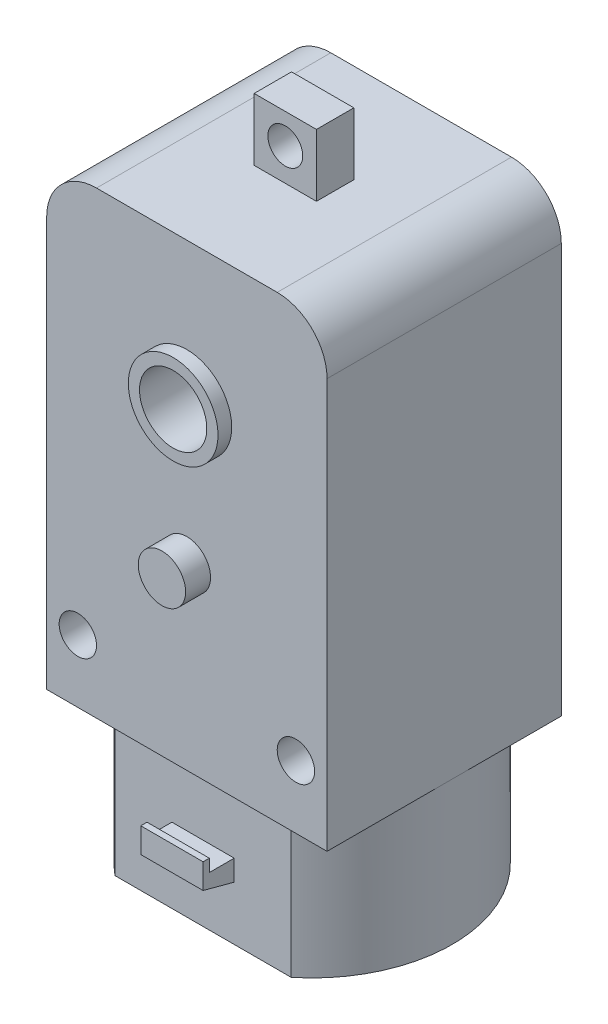
ISO-10303-21;
HEADER;
FILE_DESCRIPTION(('STEP AP214'),'2;1');
FILE_NAME('part.step','',(''),(''),'','','');
FILE_SCHEMA(('AUTOMOTIVE_DESIGN { 1 0 10303 214 1 1 1 1 }'));
ENDSEC;
DATA;
#1=APPLICATION_CONTEXT('core data for automotive mechanical design processes');
#2=APPLICATION_PROTOCOL_DEFINITION('international standard','automotive_design',2000,#1);
#3=PRODUCT_CONTEXT('',#1,'mechanical');
#4=PRODUCT('Part','Part','',(#3));
#5=PRODUCT_RELATED_PRODUCT_CATEGORY('part','',(#4));
#6=PRODUCT_DEFINITION_FORMATION('','',#4);
#7=PRODUCT_DEFINITION_CONTEXT('part definition',#1,'design');
#8=PRODUCT_DEFINITION('design','',#6,#7);
#9=PRODUCT_DEFINITION_SHAPE('','',#8);
#10=(LENGTH_UNIT() NAMED_UNIT(*) SI_UNIT(.MILLI.,.METRE.));
#11=(NAMED_UNIT(*) PLANE_ANGLE_UNIT() SI_UNIT($,.RADIAN.));
#12=(NAMED_UNIT(*) SI_UNIT($,.STERADIAN.) SOLID_ANGLE_UNIT());
#13=UNCERTAINTY_MEASURE_WITH_UNIT(LENGTH_MEASURE(1.E-05),#10,'distance_accuracy_value','');
#14=(GEOMETRIC_REPRESENTATION_CONTEXT(3) GLOBAL_UNCERTAINTY_ASSIGNED_CONTEXT((#13)) GLOBAL_UNIT_ASSIGNED_CONTEXT((#10,
#11,#12)) REPRESENTATION_CONTEXT('',''));
#15=CARTESIAN_POINT('',(0.,0.,0.));
#16=DIRECTION('',(0.,0.,1.));
#17=DIRECTION('',(1.,0.,0.));
#18=AXIS2_PLACEMENT_3D('',#15,#16,#17);
#19=CARTESIAN_POINT('',(2.5,-30.15,3.10653855558485));
#20=DIRECTION('',(0.,1.,0.));
#21=DIRECTION('',(0.,0.,1.));
#22=AXIS2_PLACEMENT_3D('',#19,#20,#21);
#23=PLANE('',#22);
#24=DIRECTION('',(0.,0.,1.));
#25=VECTOR('',#24,1.);
#26=CARTESIAN_POINT('',(2.5,-30.15,3.10653855558485));
#27=LINE('',#26,#25);
#28=CARTESIAN_POINT('',(2.5,-30.15,1.19999999585519));
#29=VERTEX_POINT('',#28);
#30=CARTESIAN_POINT('',(2.5,-30.15,0.699999995855194));
#31=VERTEX_POINT('',#30);
#32=EDGE_CURVE('E212',#29,#31,#27,.F.);
#33=ORIENTED_EDGE('',*,*,#32,.T.);
#34=DIRECTION('',(1.,0.,0.));
#35=VECTOR('',#34,1.);
#36=CARTESIAN_POINT('',(2.5,-30.15,0.699999995855194));
#37=LINE('',#36,#35);
#38=CARTESIAN_POINT('',(-2.5,-30.15,0.699999995855194));
#39=VERTEX_POINT('',#38);
#40=EDGE_CURVE('E202',#39,#31,#37,.T.);
#41=ORIENTED_EDGE('',*,*,#40,.F.);
#42=DIRECTION('',(0.,0.,-1.));
#43=VECTOR('',#42,1.);
#44=CARTESIAN_POINT('',(-2.5,-30.15,-0.0500000020724036));
#45=LINE('',#44,#43);
#46=CARTESIAN_POINT('',(-2.5,-30.15,1.19999999585519));
#47=VERTEX_POINT('',#46);
#48=EDGE_CURVE('E194',#39,#47,#45,.F.);
#49=ORIENTED_EDGE('',*,*,#48,.T.);
#50=DIRECTION('',(1.,0.,0.));
#51=VECTOR('',#50,1.);
#52=CARTESIAN_POINT('',(2.5,-30.15,1.19999999585519));
#53=LINE('',#52,#51);
#54=EDGE_CURVE('E199',#29,#47,#53,.F.);
#55=ORIENTED_EDGE('',*,*,#54,.F.);
#56=EDGE_LOOP('',(#33,#41,#49,#55));
#57=FACE_BOUND('',#56,.T.);
#58=ADVANCED_FACE('F16',(#57),#23,.T.);
#59=CARTESIAN_POINT('',(2.5,-31.6388131835958,1.19999999585519));
#60=DIRECTION('',(0.,0.,1.));
#61=DIRECTION('',(1.,0.,0.));
#62=AXIS2_PLACEMENT_3D('',#59,#60,#61);
#63=PLANE('',#62);
#64=DIRECTION('',(0.,1.,0.));
#65=VECTOR('',#64,1.);
#66=CARTESIAN_POINT('',(2.5,-31.4,1.19999999585519));
#67=LINE('',#66,#65);
#68=CARTESIAN_POINT('',(2.5,-32.15,1.19999999585519));
#69=VERTEX_POINT('',#68);
#70=EDGE_CURVE('E211',#29,#69,#67,.F.);
#71=ORIENTED_EDGE('',*,*,#70,.F.);
#72=ORIENTED_EDGE('',*,*,#54,.T.);
#73=DIRECTION('',(0.,1.,0.));
#74=VECTOR('',#73,1.);
#75=CARTESIAN_POINT('',(-2.5,-31.4,1.19999999585519));
#76=LINE('',#75,#74);
#77=CARTESIAN_POINT('',(-2.5,-32.15,1.19999999585519));
#78=VERTEX_POINT('',#77);
#79=EDGE_CURVE('E204',#47,#78,#76,.F.);
#80=ORIENTED_EDGE('',*,*,#79,.T.);
#81=DIRECTION('',(1.,0.,0.));
#82=VECTOR('',#81,1.);
#83=CARTESIAN_POINT('',(2.5,-32.15,1.19999999585519));
#84=LINE('',#83,#82);
#85=EDGE_CURVE('E345',#69,#78,#84,.F.);
#86=ORIENTED_EDGE('',*,*,#85,.F.);
#87=EDGE_LOOP('',(#71,#72,#80,#86));
#88=FACE_BOUND('',#87,.T.);
#89=ADVANCED_FACE('F208',(#88),#63,.T.);
#90=CARTESIAN_POINT('',(-2.5,-31.4,-0.0500000020724036));
#91=DIRECTION('',(1.,0.,0.));
#92=DIRECTION('',(0.,0.,-1.));
#93=AXIS2_PLACEMENT_3D('',#90,#91,#92);
#94=PLANE('',#93);
#95=ORIENTED_EDGE('',*,*,#79,.F.);
#96=ORIENTED_EDGE('',*,*,#48,.F.);
#97=DIRECTION('',(0.,1.,0.));
#98=VECTOR('',#97,1.);
#99=CARTESIAN_POINT('',(-2.5,-31.1105582310275,0.699999995855194));
#100=LINE('',#99,#98);
#101=CARTESIAN_POINT('',(-2.5,-31.15,0.699999995855193));
#102=VERTEX_POINT('',#101);
#103=EDGE_CURVE('E218',#102,#39,#100,.T.);
#104=ORIENTED_EDGE('',*,*,#103,.F.);
#105=DIRECTION('',(0.,0.,1.));
#106=VECTOR('',#105,1.);
#107=CARTESIAN_POINT('',(-2.5,-31.15,0.611455472558737));
#108=LINE('',#107,#106);
#109=CARTESIAN_POINT('',(-2.5,-31.15,-1.3));
#110=VERTEX_POINT('',#109);
#111=EDGE_CURVE('E342',#110,#102,#108,.T.);
#112=ORIENTED_EDGE('',*,*,#111,.F.);
#113=DIRECTION('',(0.,1.,0.));
#114=VECTOR('',#113,1.);
#115=CARTESIAN_POINT('',(-2.5,-31.4,-1.3));
#116=LINE('',#115,#114);
#117=CARTESIAN_POINT('',(-2.5,-32.8198729799672,-1.3));
#118=VERTEX_POINT('',#117);
#119=EDGE_CURVE('E205',#118,#110,#116,.T.);
#120=ORIENTED_EDGE('',*,*,#119,.F.);
#121=DIRECTION('',(0.,-0.258819045102521,-0.965925826289068));
#122=VECTOR('',#121,1.);
#123=CARTESIAN_POINT('',(-2.5,-32.1553701212937,1.17995843034424));
#124=LINE('',#123,#122);
#125=EDGE_CURVE('E216',#78,#118,#124,.T.);
#126=ORIENTED_EDGE('',*,*,#125,.F.);
#127=EDGE_LOOP('',(#95,#96,#104,#112,#120,#126));
#128=FACE_BOUND('',#127,.T.);
#129=ADVANCED_FACE('F214',(#128),#94,.F.);
#130=CARTESIAN_POINT('',(2.5,-31.1105582310275,0.699999995855194));
#131=DIRECTION('',(0.,0.,-1.));
#132=DIRECTION('',(0.,1.,0.));
#133=AXIS2_PLACEMENT_3D('',#130,#131,#132);
#134=PLANE('',#133);
#135=DIRECTION('',(0.,1.,0.));
#136=VECTOR('',#135,1.);
#137=CARTESIAN_POINT('',(2.5,-31.4,0.699999995855193));
#138=LINE('',#137,#136);
#139=CARTESIAN_POINT('',(2.5,-31.15,0.699999995855193));
#140=VERTEX_POINT('',#139);
#141=EDGE_CURVE('E352',#140,#31,#138,.T.);
#142=ORIENTED_EDGE('',*,*,#141,.F.);
#143=DIRECTION('',(1.,0.,0.));
#144=VECTOR('',#143,1.);
#145=CARTESIAN_POINT('',(2.5,-31.15,0.699999995855193));
#146=LINE('',#145,#144);
#147=EDGE_CURVE('E339',#102,#140,#146,.T.);
#148=ORIENTED_EDGE('',*,*,#147,.F.);
#149=ORIENTED_EDGE('',*,*,#103,.T.);
#150=ORIENTED_EDGE('',*,*,#40,.T.);
#151=EDGE_LOOP('',(#142,#148,#149,#150));
#152=FACE_BOUND('',#151,.T.);
#153=ADVANCED_FACE('F357',(#152),#134,.T.);
#154=CARTESIAN_POINT('',(2.5,-31.4,-0.0500000020724036));
#155=DIRECTION('',(1.,0.,0.));
#156=DIRECTION('',(0.,0.,-1.));
#157=AXIS2_PLACEMENT_3D('',#154,#155,#156);
#158=PLANE('',#157);
#159=ORIENTED_EDGE('',*,*,#32,.F.);
#160=ORIENTED_EDGE('',*,*,#70,.T.);
#161=DIRECTION('',(0.,-0.258819045102521,-0.965925826289068));
#162=VECTOR('',#161,1.);
#163=CARTESIAN_POINT('',(2.5,-32.1553701212937,1.17995843034424));
#164=LINE('',#163,#162);
#165=CARTESIAN_POINT('',(2.5,-32.8198729799672,-1.3));
#166=VERTEX_POINT('',#165);
#167=EDGE_CURVE('E347',#166,#69,#164,.F.);
#168=ORIENTED_EDGE('',*,*,#167,.F.);
#169=DIRECTION('',(0.,1.,0.));
#170=VECTOR('',#169,1.);
#171=CARTESIAN_POINT('',(2.5,-31.4,-1.3));
#172=LINE('',#171,#170);
#173=CARTESIAN_POINT('',(2.5,-31.15,-1.3));
#174=VERTEX_POINT('',#173);
#175=EDGE_CURVE('E355',#166,#174,#172,.T.);
#176=ORIENTED_EDGE('',*,*,#175,.T.);
#177=DIRECTION('',(0.,0.,1.));
#178=VECTOR('',#177,1.);
#179=CARTESIAN_POINT('',(2.5,-31.15,0.611455472558737));
#180=LINE('',#179,#178);
#181=EDGE_CURVE('E336',#140,#174,#180,.F.);
#182=ORIENTED_EDGE('',*,*,#181,.F.);
#183=ORIENTED_EDGE('',*,*,#141,.T.);
#184=EDGE_LOOP('',(#159,#160,#168,#176,#182,#183));
#185=FACE_BOUND('',#184,.T.);
#186=ADVANCED_FACE('F361',(#185),#158,.T.);
#187=CARTESIAN_POINT('',(0.,-4.725,2.));
#188=DIRECTION('',(0.,0.,1.));
#189=DIRECTION('',(1.,0.,0.));
#190=AXIS2_PLACEMENT_3D('',#187,#188,#189);
#191=PLANE('',#190);
#192=CARTESIAN_POINT('',(0.,-11.3,2.));
#193=DIRECTION('',(0.,0.,1.));
#194=DIRECTION('',(1.,0.,0.));
#195=AXIS2_PLACEMENT_3D('',#192,#193,#194);
#196=CIRCLE('',#195,1.9);
#197=CARTESIAN_POINT('',(1.9,-11.3,2.));
#198=VERTEX_POINT('',#197);
#199=EDGE_CURVE('E19',#198,#198,#196,.F.);
#200=ORIENTED_EDGE('',*,*,#199,.F.);
#201=EDGE_LOOP('',(#200));
#202=FACE_BOUND('',#201,.T.);
#203=ADVANCED_FACE('F913',(#202),#191,.T.);
#204=CARTESIAN_POINT('',(2.5,-30.15,-23.2065385555848));
#205=DIRECTION('',(0.,1.,0.));
#206=DIRECTION('',(0.,0.,1.));
#207=AXIS2_PLACEMENT_3D('',#204,#205,#206);
#208=PLANE('',#207);
#209=DIRECTION('',(0.,0.,-1.));
#210=VECTOR('',#209,1.);
#211=CARTESIAN_POINT('',(2.5,-30.15,-20.0499999979276));
#212=LINE('',#211,#210);
#213=CARTESIAN_POINT('',(2.5,-30.15,-21.2999999958552));
#214=VERTEX_POINT('',#213);
#215=CARTESIAN_POINT('',(2.5,-30.15,-20.7999999958552));
#216=VERTEX_POINT('',#215);
#217=EDGE_CURVE('E321',#214,#216,#212,.F.);
#218=ORIENTED_EDGE('',*,*,#217,.F.);
#219=DIRECTION('',(-1.,0.,0.));
#220=VECTOR('',#219,1.);
#221=CARTESIAN_POINT('',(2.5,-30.15,-21.2999999958552));
#222=LINE('',#221,#220);
#223=CARTESIAN_POINT('',(-2.5,-30.15,-21.2999999958552));
#224=VERTEX_POINT('',#223);
#225=EDGE_CURVE('E334',#224,#214,#222,.F.);
#226=ORIENTED_EDGE('',*,*,#225,.F.);
#227=DIRECTION('',(0.,0.,-1.));
#228=VECTOR('',#227,1.);
#229=CARTESIAN_POINT('',(-2.5,-30.15,-20.0499999979276));
#230=LINE('',#229,#228);
#231=CARTESIAN_POINT('',(-2.5,-30.15,-20.7999999958552));
#232=VERTEX_POINT('',#231);
#233=EDGE_CURVE('E329',#224,#232,#230,.F.);
#234=ORIENTED_EDGE('',*,*,#233,.T.);
#235=DIRECTION('',(1.,0.,0.));
#236=VECTOR('',#235,1.);
#237=CARTESIAN_POINT('',(2.5,-30.15,-20.7999999958552));
#238=LINE('',#237,#236);
#239=EDGE_CURVE('E304',#216,#232,#238,.F.);
#240=ORIENTED_EDGE('',*,*,#239,.F.);
#241=EDGE_LOOP('',(#218,#226,#234,#240));
#242=FACE_BOUND('',#241,.T.);
#243=ADVANCED_FACE('F903',(#242),#208,.T.);
#244=CARTESIAN_POINT('',(0.,13.8,-7.9));
#245=DIRECTION('',(0.,0.,1.));
#246=DIRECTION('',(1.,0.,0.));
#247=AXIS2_PLACEMENT_3D('',#244,#245,#246);
#248=CYLINDRICAL_SURFACE('',#247,1.4);
#249=CARTESIAN_POINT('',(0.,13.8,-10.9));
#250=DIRECTION('',(0.,0.,1.));
#251=DIRECTION('',(1.,0.,0.));
#252=AXIS2_PLACEMENT_3D('',#249,#250,#251);
#253=CIRCLE('',#252,1.4);
#254=CARTESIAN_POINT('',(1.4,13.8,-10.9));
#255=VERTEX_POINT('',#254);
#256=EDGE_CURVE('E291',#255,#255,#253,.F.);
#257=ORIENTED_EDGE('',*,*,#256,.T.);
#258=EDGE_LOOP('',(#257));
#259=FACE_BOUND('',#258,.T.);
#260=CARTESIAN_POINT('',(0.,13.8,-7.9));
#261=DIRECTION('',(0.,0.,1.));
#262=DIRECTION('',(1.,0.,0.));
#263=AXIS2_PLACEMENT_3D('',#260,#261,#262);
#264=CIRCLE('',#263,1.4);
#265=CARTESIAN_POINT('',(1.4,13.8,-7.9));
#266=VERTEX_POINT('',#265);
#267=EDGE_CURVE('E295',#266,#266,#264,.T.);
#268=ORIENTED_EDGE('',*,*,#267,.T.);
#269=EDGE_LOOP('',(#268));
#270=FACE_BOUND('',#269,.T.);
#271=ADVANCED_FACE('F894',(#259,#270),#248,.F.);
#272=CARTESIAN_POINT('',(0.00601622741669446,16.2,-7.9));
#273=DIRECTION('',(0.,-1.,0.));
#274=DIRECTION('',(1.,0.,0.));
#275=AXIS2_PLACEMENT_3D('',#272,#273,#274);
#276=PLANE('',#275);
#277=DIRECTION('',(1.,0.,0.));
#278=VECTOR('',#277,1.);
#279=CARTESIAN_POINT('',(0.,16.2,-10.9));
#280=LINE('',#279,#278);
#281=CARTESIAN_POINT('',(2.5,16.2,-10.9));
#282=VERTEX_POINT('',#281);
#283=CARTESIAN_POINT('',(-2.5,16.2,-10.9));
#284=VERTEX_POINT('',#283);
#285=EDGE_CURVE('E400',#282,#284,#280,.F.);
#286=ORIENTED_EDGE('',*,*,#285,.T.);
#287=DIRECTION('',(0.,0.,1.));
#288=VECTOR('',#287,1.);
#289=CARTESIAN_POINT('',(-2.5,16.2,-7.9));
#290=LINE('',#289,#288);
#291=CARTESIAN_POINT('',(-2.5,16.2,-7.9));
#292=VERTEX_POINT('',#291);
#293=EDGE_CURVE('E376',#284,#292,#290,.T.);
#294=ORIENTED_EDGE('',*,*,#293,.T.);
#295=DIRECTION('',(-1.,0.,0.));
#296=VECTOR('',#295,1.);
#297=CARTESIAN_POINT('',(0.,16.2,-7.9));
#298=LINE('',#297,#296);
#299=CARTESIAN_POINT('',(2.5,16.2,-7.9));
#300=VERTEX_POINT('',#299);
#301=EDGE_CURVE('E298',#292,#300,#298,.F.);
#302=ORIENTED_EDGE('',*,*,#301,.T.);
#303=DIRECTION('',(0.,0.,1.));
#304=VECTOR('',#303,1.);
#305=CARTESIAN_POINT('',(2.5,16.2,-7.9));
#306=LINE('',#305,#304);
#307=EDGE_CURVE('E302',#300,#282,#306,.F.);
#308=ORIENTED_EDGE('',*,*,#307,.T.);
#309=EDGE_LOOP('',(#286,#294,#302,#308));
#310=FACE_BOUND('',#309,.T.);
#311=ADVANCED_FACE('F402',(#310),#276,.F.);
#312=CARTESIAN_POINT('',(2.5,-32.1553701212937,1.17995843034424));
#313=DIRECTION('',(0.,-0.965925826289068,0.258819045102521));
#314=DIRECTION('',(0.,-0.258819045102521,-0.965925826289068));
#315=AXIS2_PLACEMENT_3D('',#312,#313,#314);
#316=PLANE('',#315);
#317=ORIENTED_EDGE('',*,*,#167,.T.);
#318=ORIENTED_EDGE('',*,*,#85,.T.);
#319=ORIENTED_EDGE('',*,*,#125,.T.);
#320=DIRECTION('',(1.,0.,0.));
#321=VECTOR('',#320,1.);
#322=CARTESIAN_POINT('',(0.00295420484333825,-32.8198729799672,-1.3));
#323=LINE('',#322,#321);
#324=EDGE_CURVE('E374',#166,#118,#323,.F.);
#325=ORIENTED_EDGE('',*,*,#324,.F.);
#326=EDGE_LOOP('',(#317,#318,#319,#325));
#327=FACE_BOUND('',#326,.T.);
#328=ADVANCED_FACE('F373',(#327),#316,.T.);
#329=CARTESIAN_POINT('',(2.5,-31.15,0.611455472558737));
#330=DIRECTION('',(0.,1.,0.));
#331=DIRECTION('',(0.,0.,1.));
#332=AXIS2_PLACEMENT_3D('',#329,#330,#331);
#333=PLANE('',#332);
#334=ORIENTED_EDGE('',*,*,#181,.T.);
#335=DIRECTION('',(1.,0.,0.));
#336=VECTOR('',#335,1.);
#337=CARTESIAN_POINT('',(0.00295420484333825,-31.15,-1.3));
#338=LINE('',#337,#336);
#339=EDGE_CURVE('E368',#110,#174,#338,.T.);
#340=ORIENTED_EDGE('',*,*,#339,.F.);
#341=ORIENTED_EDGE('',*,*,#111,.T.);
#342=ORIENTED_EDGE('',*,*,#147,.T.);
#343=EDGE_LOOP('',(#334,#340,#341,#342));
#344=FACE_BOUND('',#343,.T.);
#345=ADVANCED_FACE('F366',(#344),#333,.T.);
#346=CARTESIAN_POINT('',(0.,-11.3,2.));
#347=DIRECTION('',(0.,0.,1.));
#348=DIRECTION('',(1.,0.,0.));
#349=AXIS2_PLACEMENT_3D('',#346,#347,#348);
#350=CYLINDRICAL_SURFACE('',#349,1.9);
#351=CARTESIAN_POINT('',(0.,-11.3,0.));
#352=DIRECTION('',(0.,0.,1.));
#353=DIRECTION('',(1.,0.,0.));
#354=AXIS2_PLACEMENT_3D('',#351,#352,#353);
#355=CIRCLE('',#354,1.9);
#356=CARTESIAN_POINT('',(1.9,-11.3,0.));
#357=VERTEX_POINT('',#356);
#358=EDGE_CURVE('E284',#357,#357,#355,.F.);
#359=ORIENTED_EDGE('',*,*,#358,.F.);
#360=EDGE_LOOP('',(#359));
#361=FACE_BOUND('',#360,.T.);
#362=ORIENTED_EDGE('',*,*,#199,.T.);
#363=EDGE_LOOP('',(#362));
#364=FACE_BOUND('',#363,.T.);
#365=ADVANCED_FACE('F859',(#361,#364),#350,.T.);
#366=CARTESIAN_POINT('',(0.,0.,500000.));
#367=DIRECTION('',(0.,0.,1.));
#368=DIRECTION('',(1.,0.,0.));
#369=AXIS2_PLACEMENT_3D('',#366,#367,#368);
#370=CYLINDRICAL_SURFACE('',#369,3.6);
#371=CARTESIAN_POINT('',(0.,0.,1.10000000000809));
#372=DIRECTION('',(0.,0.,1.));
#373=DIRECTION('',(1.,0.,0.));
#374=AXIS2_PLACEMENT_3D('',#371,#372,#373);
#375=CIRCLE('',#374,3.6);
#376=CARTESIAN_POINT('',(3.6,0.,1.10000000000809));
#377=VERTEX_POINT('',#376);
#378=EDGE_CURVE('E279',#377,#377,#375,.T.);
#379=ORIENTED_EDGE('',*,*,#378,.F.);
#380=EDGE_LOOP('',(#379));
#381=FACE_BOUND('',#380,.T.);
#382=CARTESIAN_POINT('',(0.,0.,0.));
#383=DIRECTION('',(0.,0.,1.));
#384=DIRECTION('',(1.,0.,0.));
#385=AXIS2_PLACEMENT_3D('',#382,#383,#384);
#386=CIRCLE('',#385,3.6);
#387=CARTESIAN_POINT('',(3.6,0.,0.));
#388=VERTEX_POINT('',#387);
#389=EDGE_CURVE('E287',#388,#388,#386,.F.);
#390=ORIENTED_EDGE('',*,*,#389,.F.);
#391=EDGE_LOOP('',(#390));
#392=FACE_BOUND('',#391,.T.);
#393=ADVANCED_FACE('F849',(#381,#392),#370,.T.);
#394=CARTESIAN_POINT('',(2.5,-31.6388131835958,-21.2999999958552));
#395=DIRECTION('',(0.,0.,-1.));
#396=DIRECTION('',(-1.,0.,0.));
#397=AXIS2_PLACEMENT_3D('',#394,#395,#396);
#398=PLANE('',#397);
#399=DIRECTION('',(0.,1.,0.));
#400=VECTOR('',#399,1.);
#401=CARTESIAN_POINT('',(2.5,-31.4,-21.2999999958552));
#402=LINE('',#401,#400);
#403=CARTESIAN_POINT('',(2.5,-32.15,-21.2999999958552));
#404=VERTEX_POINT('',#403);
#405=EDGE_CURVE('E323',#404,#214,#402,.T.);
#406=ORIENTED_EDGE('',*,*,#405,.F.);
#407=DIRECTION('',(1.,0.,0.));
#408=VECTOR('',#407,1.);
#409=CARTESIAN_POINT('',(2.5,-32.15,-21.2999999958552));
#410=LINE('',#409,#408);
#411=CARTESIAN_POINT('',(-2.5,-32.15,-21.2999999958552));
#412=VERTEX_POINT('',#411);
#413=EDGE_CURVE('E440',#412,#404,#410,.T.);
#414=ORIENTED_EDGE('',*,*,#413,.F.);
#415=DIRECTION('',(0.,1.,0.));
#416=VECTOR('',#415,1.);
#417=CARTESIAN_POINT('',(-2.5,-31.4,-21.2999999958552));
#418=LINE('',#417,#416);
#419=EDGE_CURVE('E331',#412,#224,#418,.T.);
#420=ORIENTED_EDGE('',*,*,#419,.T.);
#421=ORIENTED_EDGE('',*,*,#225,.T.);
#422=EDGE_LOOP('',(#406,#414,#420,#421));
#423=FACE_BOUND('',#422,.T.);
#424=ADVANCED_FACE('F839',(#423),#398,.T.);
#425=CARTESIAN_POINT('',(-2.5,-31.4,-20.0499999979276));
#426=DIRECTION('',(1.,0.,0.));
#427=DIRECTION('',(0.,0.,-1.));
#428=AXIS2_PLACEMENT_3D('',#425,#426,#427);
#429=PLANE('',#428);
#430=DIRECTION('',(0.,1.,0.));
#431=VECTOR('',#430,1.);
#432=CARTESIAN_POINT('',(-2.5,-31.4,-18.8));
#433=LINE('',#432,#431);
#434=CARTESIAN_POINT('',(-2.5,-31.15,-18.8));
#435=VERTEX_POINT('',#434);
#436=CARTESIAN_POINT('',(-2.5,-32.8198729799672,-18.8));
#437=VERTEX_POINT('',#436);
#438=EDGE_CURVE('E326',#435,#437,#433,.F.);
#439=ORIENTED_EDGE('',*,*,#438,.F.);
#440=DIRECTION('',(0.,0.,1.));
#441=VECTOR('',#440,1.);
#442=CARTESIAN_POINT('',(-2.5,-31.15,-20.7114554725587));
#443=LINE('',#442,#441);
#444=CARTESIAN_POINT('',(-2.5,-31.15,-20.7999999958552));
#445=VERTEX_POINT('',#444);
#446=EDGE_CURVE('E434',#445,#435,#443,.T.);
#447=ORIENTED_EDGE('',*,*,#446,.F.);
#448=DIRECTION('',(0.,-1.,0.));
#449=VECTOR('',#448,1.);
#450=CARTESIAN_POINT('',(-2.5,-31.1105582310275,-20.7999999958552));
#451=LINE('',#450,#449);
#452=EDGE_CURVE('E315',#232,#445,#451,.T.);
#453=ORIENTED_EDGE('',*,*,#452,.F.);
#454=ORIENTED_EDGE('',*,*,#233,.F.);
#455=ORIENTED_EDGE('',*,*,#419,.F.);
#456=DIRECTION('',(0.,0.258819045102521,-0.965925826289068));
#457=VECTOR('',#456,1.);
#458=CARTESIAN_POINT('',(-2.5,-32.1553701212937,-21.2799584303442));
#459=LINE('',#458,#457);
#460=EDGE_CURVE('E282',#437,#412,#459,.T.);
#461=ORIENTED_EDGE('',*,*,#460,.F.);
#462=EDGE_LOOP('',(#439,#447,#453,#454,#455,#461));
#463=FACE_BOUND('',#462,.T.);
#464=ADVANCED_FACE('F829',(#463),#429,.F.);
#465=CARTESIAN_POINT('',(2.5,-31.4,-20.0499999979276));
#466=DIRECTION('',(1.,0.,0.));
#467=DIRECTION('',(0.,0.,-1.));
#468=AXIS2_PLACEMENT_3D('',#465,#466,#467);
#469=PLANE('',#468);
#470=DIRECTION('',(0.,0.,1.));
#471=VECTOR('',#470,1.);
#472=CARTESIAN_POINT('',(2.5,-31.15,-20.7114554725587));
#473=LINE('',#472,#471);
#474=CARTESIAN_POINT('',(2.5,-31.15,-18.8));
#475=VERTEX_POINT('',#474);
#476=CARTESIAN_POINT('',(2.5,-31.15,-20.7999999958552));
#477=VERTEX_POINT('',#476);
#478=EDGE_CURVE('E431',#475,#477,#473,.F.);
#479=ORIENTED_EDGE('',*,*,#478,.F.);
#480=DIRECTION('',(0.,1.,0.));
#481=VECTOR('',#480,1.);
#482=CARTESIAN_POINT('',(2.5,-31.4,-18.8));
#483=LINE('',#482,#481);
#484=CARTESIAN_POINT('',(2.5,-32.8198729799672,-18.8));
#485=VERTEX_POINT('',#484);
#486=EDGE_CURVE('E318',#475,#485,#483,.F.);
#487=ORIENTED_EDGE('',*,*,#486,.T.);
#488=DIRECTION('',(0.,0.258819045102521,-0.965925826289068));
#489=VECTOR('',#488,1.);
#490=CARTESIAN_POINT('',(2.5,-32.1553701212937,-21.2799584303442));
#491=LINE('',#490,#489);
#492=EDGE_CURVE('E437',#404,#485,#491,.F.);
#493=ORIENTED_EDGE('',*,*,#492,.F.);
#494=ORIENTED_EDGE('',*,*,#405,.T.);
#495=ORIENTED_EDGE('',*,*,#217,.T.);
#496=DIRECTION('',(0.,-1.,0.));
#497=VECTOR('',#496,1.);
#498=CARTESIAN_POINT('',(2.5,-31.1105582310275,-20.7999999958552));
#499=LINE('',#498,#497);
#500=EDGE_CURVE('E309',#477,#216,#499,.F.);
#501=ORIENTED_EDGE('',*,*,#500,.F.);
#502=EDGE_LOOP('',(#479,#487,#493,#494,#495,#501));
#503=FACE_BOUND('',#502,.T.);
#504=ADVANCED_FACE('F819',(#503),#469,.T.);
#505=CARTESIAN_POINT('',(2.5,-31.1105582310275,-20.7999999958552));
#506=DIRECTION('',(0.,0.,1.));
#507=DIRECTION('',(0.,-1.,0.));
#508=AXIS2_PLACEMENT_3D('',#505,#506,#507);
#509=PLANE('',#508);
#510=ORIENTED_EDGE('',*,*,#500,.T.);
#511=ORIENTED_EDGE('',*,*,#239,.T.);
#512=ORIENTED_EDGE('',*,*,#452,.T.);
#513=DIRECTION('',(1.,0.,0.));
#514=VECTOR('',#513,1.);
#515=CARTESIAN_POINT('',(2.5,-31.15,-20.7999999958552));
#516=LINE('',#515,#514);
#517=EDGE_CURVE('E425',#477,#445,#516,.F.);
#518=ORIENTED_EDGE('',*,*,#517,.F.);
#519=EDGE_LOOP('',(#510,#511,#512,#518));
#520=FACE_BOUND('',#519,.T.);
#521=ADVANCED_FACE('F809',(#520),#509,.T.);
#522=CARTESIAN_POINT('',(0.,-4.725,-7.9));
#523=DIRECTION('',(0.,0.,-1.));
#524=DIRECTION('',(-1.,0.,0.));
#525=AXIS2_PLACEMENT_3D('',#522,#523,#524);
#526=PLANE('',#525);
#527=ORIENTED_EDGE('',*,*,#267,.F.);
#528=EDGE_LOOP('',(#527));
#529=FACE_BOUND('',#528,.T.);
#530=ORIENTED_EDGE('',*,*,#301,.F.);
#531=DIRECTION('',(0.,1.,0.));
#532=VECTOR('',#531,1.);
#533=CARTESIAN_POINT('',(-2.5,12.9084715276957,-7.9));
#534=LINE('',#533,#532);
#535=CARTESIAN_POINT('',(-2.5,11.2,-7.9));
#536=VERTEX_POINT('',#535);
#537=EDGE_CURVE('E293',#292,#536,#534,.F.);
#538=ORIENTED_EDGE('',*,*,#537,.T.);
#539=DIRECTION('',(1.,0.,0.));
#540=VECTOR('',#539,1.);
#541=CARTESIAN_POINT('',(1.14267585277557,11.2,-7.9));
#542=LINE('',#541,#540);
#543=CARTESIAN_POINT('',(2.5,11.2,-7.9));
#544=VERTEX_POINT('',#543);
#545=EDGE_CURVE('E420',#536,#544,#542,.T.);
#546=ORIENTED_EDGE('',*,*,#545,.T.);
#547=DIRECTION('',(0.,-1.,0.));
#548=VECTOR('',#547,1.);
#549=CARTESIAN_POINT('',(2.5,14.4915284723043,-7.9));
#550=LINE('',#549,#548);
#551=EDGE_CURVE('E297',#544,#300,#550,.F.);
#552=ORIENTED_EDGE('',*,*,#551,.T.);
#553=EDGE_LOOP('',(#530,#538,#546,#552));
#554=FACE_BOUND('',#553,.T.);
#555=ADVANCED_FACE('F419',(#529,#554),#526,.F.);
#556=CARTESIAN_POINT('',(2.5,14.4915284723043,-7.9));
#557=DIRECTION('',(-1.,0.,0.));
#558=DIRECTION('',(0.,-1.,0.));
#559=AXIS2_PLACEMENT_3D('',#556,#557,#558);
#560=PLANE('',#559);
#561=DIRECTION('',(0.,1.,0.));
#562=VECTOR('',#561,1.);
#563=CARTESIAN_POINT('',(2.5,-4.725,-10.9));
#564=LINE('',#563,#562);
#565=CARTESIAN_POINT('',(2.5,11.2,-10.9));
#566=VERTEX_POINT('',#565);
#567=EDGE_CURVE('E294',#566,#282,#564,.T.);
#568=ORIENTED_EDGE('',*,*,#567,.T.);
#569=ORIENTED_EDGE('',*,*,#307,.F.);
#570=ORIENTED_EDGE('',*,*,#551,.F.);
#571=DIRECTION('',(0.,0.,1.));
#572=VECTOR('',#571,1.);
#573=CARTESIAN_POINT('',(2.5,11.2,-9.4));
#574=LINE('',#573,#572);
#575=EDGE_CURVE('E408',#544,#566,#574,.F.);
#576=ORIENTED_EDGE('',*,*,#575,.T.);
#577=EDGE_LOOP('',(#568,#569,#570,#576));
#578=FACE_BOUND('',#577,.T.);
#579=ADVANCED_FACE('F406',(#578),#560,.F.);
#580=CARTESIAN_POINT('',(0.,-4.725,-10.9));
#581=DIRECTION('',(0.,0.,1.));
#582=DIRECTION('',(1.,0.,0.));
#583=AXIS2_PLACEMENT_3D('',#580,#581,#582);
#584=PLANE('',#583);
#585=ORIENTED_EDGE('',*,*,#256,.F.);
#586=EDGE_LOOP('',(#585));
#587=FACE_BOUND('',#586,.T.);
#588=DIRECTION('',(1.,0.,0.));
#589=VECTOR('',#588,1.);
#590=CARTESIAN_POINT('',(1.14267585277557,11.2,-10.9));
#591=LINE('',#590,#589);
#592=CARTESIAN_POINT('',(-2.5,11.2,-10.9));
#593=VERTEX_POINT('',#592);
#594=EDGE_CURVE('E106',#566,#593,#591,.F.);
#595=ORIENTED_EDGE('',*,*,#594,.T.);
#596=DIRECTION('',(0.,1.,0.));
#597=VECTOR('',#596,1.);
#598=CARTESIAN_POINT('',(-2.5,12.9084715276957,-10.9));
#599=LINE('',#598,#597);
#600=EDGE_CURVE('E379',#593,#284,#599,.T.);
#601=ORIENTED_EDGE('',*,*,#600,.T.);
#602=ORIENTED_EDGE('',*,*,#285,.F.);
#603=ORIENTED_EDGE('',*,*,#567,.F.);
#604=EDGE_LOOP('',(#595,#601,#602,#603));
#605=FACE_BOUND('',#604,.T.);
#606=ADVANCED_FACE('F409',(#587,#605),#584,.F.);
#607=CARTESIAN_POINT('',(-2.5,12.9084715276957,-7.9));
#608=DIRECTION('',(1.,0.,0.));
#609=DIRECTION('',(0.,1.,0.));
#610=AXIS2_PLACEMENT_3D('',#607,#608,#609);
#611=PLANE('',#610);
#612=ORIENTED_EDGE('',*,*,#600,.F.);
#613=DIRECTION('',(0.,0.,1.));
#614=VECTOR('',#613,1.);
#615=CARTESIAN_POINT('',(-2.5,11.2,-9.4));
#616=LINE('',#615,#614);
#617=EDGE_CURVE('E416',#593,#536,#616,.T.);
#618=ORIENTED_EDGE('',*,*,#617,.T.);
#619=ORIENTED_EDGE('',*,*,#537,.F.);
#620=ORIENTED_EDGE('',*,*,#293,.F.);
#621=EDGE_LOOP('',(#612,#618,#619,#620));
#622=FACE_BOUND('',#621,.T.);
#623=ADVANCED_FACE('F415',(#622),#611,.F.);
#624=CARTESIAN_POINT('',(0.00295420484333825,-37.15,-1.3));
#625=DIRECTION('',(0.,0.,1.));
#626=DIRECTION('',(1.,0.,0.));
#627=AXIS2_PLACEMENT_3D('',#624,#625,#626);
#628=PLANE('',#627);
#629=DIRECTION('',(1.,0.,0.));
#630=VECTOR('',#629,1.);
#631=CARTESIAN_POINT('',(0.,-37.15,-1.3));
#632=LINE('',#631,#630);
#633=CARTESIAN_POINT('',(7.07106781186546,-37.15,-1.29999999999999));
#634=VERTEX_POINT('',#633);
#635=CARTESIAN_POINT('',(-7.07106781186547,-37.15,-1.29999999999999));
#636=VERTEX_POINT('',#635);
#637=EDGE_CURVE('E265',#634,#636,#632,.F.);
#638=ORIENTED_EDGE('',*,*,#637,.F.);
#639=DIRECTION('',(0.,-1.,0.));
#640=VECTOR('',#639,1.);
#641=CARTESIAN_POINT('',(7.07106781186546,-37.15,-1.29999999999999));
#642=LINE('',#641,#640);
#643=CARTESIAN_POINT('',(7.07106781186547,-25.65,-1.29999999999999));
#644=VERTEX_POINT('',#643);
#645=EDGE_CURVE('E269',#644,#634,#642,.T.);
#646=ORIENTED_EDGE('',*,*,#645,.F.);
#647=DIRECTION('',(1.,0.,0.));
#648=VECTOR('',#647,1.);
#649=CARTESIAN_POINT('',(1.14267585277557,-25.65,-1.3));
#650=LINE('',#649,#648);
#651=CARTESIAN_POINT('',(-7.07106781186547,-25.65,-1.29999999999999));
#652=VERTEX_POINT('',#651);
#653=EDGE_CURVE('E290',#652,#644,#650,.T.);
#654=ORIENTED_EDGE('',*,*,#653,.F.);
#655=DIRECTION('',(0.,-1.,0.));
#656=VECTOR('',#655,1.);
#657=CARTESIAN_POINT('',(-7.07106781186546,-37.15,-1.29999999999999));
#658=LINE('',#657,#656);
#659=EDGE_CURVE('E256',#636,#652,#658,.F.);
#660=ORIENTED_EDGE('',*,*,#659,.F.);
#661=EDGE_LOOP('',(#638,#646,#654,#660));
#662=FACE_BOUND('',#661,.T.);
#663=ORIENTED_EDGE('',*,*,#119,.T.);
#664=ORIENTED_EDGE('',*,*,#339,.T.);
#665=ORIENTED_EDGE('',*,*,#175,.F.);
#666=ORIENTED_EDGE('',*,*,#324,.T.);
#667=EDGE_LOOP('',(#663,#664,#665,#666));
#668=FACE_BOUND('',#667,.T.);
#669=ADVANCED_FACE('F375',(#662,#668),#628,.T.);
#670=CARTESIAN_POINT('',(1.14267585277557,-25.65,-9.4));
#671=DIRECTION('',(0.,-1.,0.));
#672=DIRECTION('',(1.,0.,0.));
#673=AXIS2_PLACEMENT_3D('',#670,#671,#672);
#674=PLANE('',#673);
#675=CARTESIAN_POINT('',(0.,-25.65,-10.05));
#676=DIRECTION('',(0.,-1.,0.));
#677=DIRECTION('',(1.,0.,0.));
#678=AXIS2_PLACEMENT_3D('',#675,#676,#677);
#679=CIRCLE('',#678,11.25);
#680=CARTESIAN_POINT('',(-11.25,-25.65,-10.05));
#681=VERTEX_POINT('',#680);
#682=EDGE_CURVE('E260',#652,#681,#679,.T.);
#683=ORIENTED_EDGE('',*,*,#682,.F.);
#684=ORIENTED_EDGE('',*,*,#653,.T.);
#685=CARTESIAN_POINT('',(0.,-25.65,-10.05));
#686=DIRECTION('',(0.,-1.,0.));
#687=DIRECTION('',(1.,0.,0.));
#688=AXIS2_PLACEMENT_3D('',#685,#686,#687);
#689=CIRCLE('',#688,11.25);
#690=CARTESIAN_POINT('',(11.25,-25.65,-10.05));
#691=VERTEX_POINT('',#690);
#692=EDGE_CURVE('E266',#691,#644,#689,.T.);
#693=ORIENTED_EDGE('',*,*,#692,.F.);
#694=DIRECTION('',(0.,0.,1.));
#695=VECTOR('',#694,1.);
#696=CARTESIAN_POINT('',(11.25,-25.65,-9.4));
#697=LINE('',#696,#695);
#698=CARTESIAN_POINT('',(11.25,-25.65,0.));
#699=VERTEX_POINT('',#698);
#700=EDGE_CURVE('E277',#691,#699,#697,.T.);
#701=ORIENTED_EDGE('',*,*,#700,.T.);
#702=DIRECTION('',(1.,0.,0.));
#703=VECTOR('',#702,1.);
#704=CARTESIAN_POINT('',(0.,-25.65,0.));
#705=LINE('',#704,#703);
#706=CARTESIAN_POINT('',(-11.25,-25.65,0.));
#707=VERTEX_POINT('',#706);
#708=EDGE_CURVE('E283',#707,#699,#705,.T.);
#709=ORIENTED_EDGE('',*,*,#708,.F.);
#710=DIRECTION('',(0.,0.,1.));
#711=VECTOR('',#710,1.);
#712=CARTESIAN_POINT('',(-11.25,-25.65,-9.4));
#713=LINE('',#712,#711);
#714=EDGE_CURVE('E451',#681,#707,#713,.T.);
#715=ORIENTED_EDGE('',*,*,#714,.F.);
#716=EDGE_LOOP('',(#683,#684,#693,#701,#709,#715));
#717=FACE_BOUND('',#716,.T.);
#718=ADVANCED_FACE('F547',(#717),#674,.T.);
#719=CARTESIAN_POINT('',(0.,-4.725,0.));
#720=DIRECTION('',(0.,0.,1.));
#721=DIRECTION('',(1.,0.,0.));
#722=AXIS2_PLACEMENT_3D('',#719,#720,#721);
#723=PLANE('',#722);
#724=CARTESIAN_POINT('',(-8.75,-20.6,0.));
#725=DIRECTION('',(0.,0.,-1.));
#726=DIRECTION('',(-1.,0.,0.));
#727=AXIS2_PLACEMENT_3D('',#724,#725,#726);
#728=CIRCLE('',#727,1.5);
#729=CARTESIAN_POINT('',(-10.25,-20.6,0.));
#730=VERTEX_POINT('',#729);
#731=EDGE_CURVE('E243',#730,#730,#728,.T.);
#732=ORIENTED_EDGE('',*,*,#731,.T.);
#733=EDGE_LOOP('',(#732));
#734=FACE_BOUND('',#733,.T.);
#735=CARTESIAN_POINT('',(8.75,-20.6,0.));
#736=DIRECTION('',(0.,0.,-1.));
#737=DIRECTION('',(-1.,0.,0.));
#738=AXIS2_PLACEMENT_3D('',#735,#736,#737);
#739=CIRCLE('',#738,1.5);
#740=CARTESIAN_POINT('',(7.25,-20.6,0.));
#741=VERTEX_POINT('',#740);
#742=EDGE_CURVE('E246',#741,#741,#739,.T.);
#743=ORIENTED_EDGE('',*,*,#742,.T.);
#744=EDGE_LOOP('',(#743));
#745=FACE_BOUND('',#744,.T.);
#746=DIRECTION('',(0.,-1.,0.));
#747=VECTOR('',#746,1.);
#748=CARTESIAN_POINT('',(11.25,-7.42060504853725,0.));
#749=LINE('',#748,#747);
#750=CARTESIAN_POINT('',(11.25,7.2,0.));
#751=VERTEX_POINT('',#750);
#752=EDGE_CURVE('E388',#699,#751,#749,.F.);
#753=ORIENTED_EDGE('',*,*,#752,.T.);
#754=CARTESIAN_POINT('',(7.25,7.2,0.));
#755=DIRECTION('',(0.,0.,-1.));
#756=DIRECTION('',(-1.,0.,0.));
#757=AXIS2_PLACEMENT_3D('',#754,#755,#756);
#758=CIRCLE('',#757,4.);
#759=CARTESIAN_POINT('',(7.25,11.2,0.));
#760=VERTEX_POINT('',#759);
#761=EDGE_CURVE('E274',#760,#751,#758,.T.);
#762=ORIENTED_EDGE('',*,*,#761,.F.);
#763=DIRECTION('',(1.,0.,0.));
#764=VECTOR('',#763,1.);
#765=CARTESIAN_POINT('',(1.14267585277557,11.2,0.));
#766=LINE('',#765,#764);
#767=CARTESIAN_POINT('',(-7.25,11.2,0.));
#768=VERTEX_POINT('',#767);
#769=EDGE_CURVE('E95',#760,#768,#766,.F.);
#770=ORIENTED_EDGE('',*,*,#769,.T.);
#771=CARTESIAN_POINT('',(-7.25,7.2,0.));
#772=DIRECTION('',(0.,0.,1.));
#773=DIRECTION('',(1.,0.,0.));
#774=AXIS2_PLACEMENT_3D('',#771,#772,#773);
#775=CIRCLE('',#774,4.);
#776=CARTESIAN_POINT('',(-11.25,7.2,0.));
#777=VERTEX_POINT('',#776);
#778=EDGE_CURVE('E249',#777,#768,#775,.F.);
#779=ORIENTED_EDGE('',*,*,#778,.F.);
#780=DIRECTION('',(0.,-1.,0.));
#781=VECTOR('',#780,1.);
#782=CARTESIAN_POINT('',(-11.25,-7.42060504853726,0.));
#783=LINE('',#782,#781);
#784=EDGE_CURVE('E255',#707,#777,#783,.F.);
#785=ORIENTED_EDGE('',*,*,#784,.F.);
#786=ORIENTED_EDGE('',*,*,#708,.T.);
#787=EDGE_LOOP('',(#753,#762,#770,#779,#785,#786));
#788=FACE_BOUND('',#787,.T.);
#789=ORIENTED_EDGE('',*,*,#358,.T.);
#790=EDGE_LOOP('',(#789));
#791=FACE_BOUND('',#790,.T.);
#792=ORIENTED_EDGE('',*,*,#389,.T.);
#793=EDGE_LOOP('',(#792));
#794=FACE_BOUND('',#793,.T.);
#795=ADVANCED_FACE('F462',(#734,#745,#788,#791,#794),#723,.T.);
#796=CARTESIAN_POINT('',(0.,-4.725,1.10000000000809));
#797=DIRECTION('',(0.,0.,1.));
#798=DIRECTION('',(1.,0.,0.));
#799=AXIS2_PLACEMENT_3D('',#796,#797,#798);
#800=PLANE('',#799);
#801=CARTESIAN_POINT('',(0.,0.,1.10000000000809));
#802=DIRECTION('',(0.,0.,-1.));
#803=DIRECTION('',(-1.,0.,0.));
#804=AXIS2_PLACEMENT_3D('',#801,#802,#803);
#805=CIRCLE('',#804,2.7);
#806=CARTESIAN_POINT('',(-2.7,0.,1.10000000000809));
#807=VERTEX_POINT('',#806);
#808=EDGE_CURVE('E239',#807,#807,#805,.T.);
#809=ORIENTED_EDGE('',*,*,#808,.T.);
#810=EDGE_LOOP('',(#809));
#811=FACE_BOUND('',#810,.T.);
#812=ORIENTED_EDGE('',*,*,#378,.T.);
#813=EDGE_LOOP('',(#812));
#814=FACE_BOUND('',#813,.T.);
#815=ADVANCED_FACE('F605',(#811,#814),#800,.T.);
#816=CARTESIAN_POINT('',(2.5,-32.1553701212937,-21.2799584303442));
#817=DIRECTION('',(0.,-0.965925826289068,-0.258819045102521));
#818=DIRECTION('',(0.,0.258819045102521,-0.965925826289068));
#819=AXIS2_PLACEMENT_3D('',#816,#817,#818);
#820=PLANE('',#819);
#821=ORIENTED_EDGE('',*,*,#492,.T.);
#822=DIRECTION('',(-1.,0.,0.));
#823=VECTOR('',#822,1.);
#824=CARTESIAN_POINT('',(0.,-32.8198729799672,-18.8));
#825=LINE('',#824,#823);
#826=EDGE_CURVE('E242',#437,#485,#825,.F.);
#827=ORIENTED_EDGE('',*,*,#826,.F.);
#828=ORIENTED_EDGE('',*,*,#460,.T.);
#829=ORIENTED_EDGE('',*,*,#413,.T.);
#830=EDGE_LOOP('',(#821,#827,#828,#829));
#831=FACE_BOUND('',#830,.T.);
#832=ADVANCED_FACE('F601',(#831),#820,.T.);
#833=CARTESIAN_POINT('',(2.5,-31.15,-20.7114554725587));
#834=DIRECTION('',(0.,1.,0.));
#835=DIRECTION('',(0.,0.,1.));
#836=AXIS2_PLACEMENT_3D('',#833,#834,#835);
#837=PLANE('',#836);
#838=ORIENTED_EDGE('',*,*,#478,.T.);
#839=ORIENTED_EDGE('',*,*,#517,.T.);
#840=ORIENTED_EDGE('',*,*,#446,.T.);
#841=DIRECTION('',(-1.,0.,0.));
#842=VECTOR('',#841,1.);
#843=CARTESIAN_POINT('',(0.,-31.15,-18.8));
#844=LINE('',#843,#842);
#845=EDGE_CURVE('E485',#475,#435,#844,.T.);
#846=ORIENTED_EDGE('',*,*,#845,.F.);
#847=EDGE_LOOP('',(#838,#839,#840,#846));
#848=FACE_BOUND('',#847,.T.);
#849=ADVANCED_FACE('F598',(#848),#837,.T.);
#850=CARTESIAN_POINT('',(1.14267585277557,11.2,-9.4));
#851=DIRECTION('',(0.,-1.,0.));
#852=DIRECTION('',(1.,0.,0.));
#853=AXIS2_PLACEMENT_3D('',#850,#851,#852);
#854=PLANE('',#853);
#855=DIRECTION('',(0.,0.,1.));
#856=VECTOR('',#855,1.);
#857=CARTESIAN_POINT('',(-7.25,11.2,-9.4));
#858=LINE('',#857,#856);
#859=CARTESIAN_POINT('',(-7.25,11.2,-18.8));
#860=VERTEX_POINT('',#859);
#861=EDGE_CURVE('E454',#768,#860,#858,.F.);
#862=ORIENTED_EDGE('',*,*,#861,.F.);
#863=ORIENTED_EDGE('',*,*,#769,.F.);
#864=DIRECTION('',(0.,0.,-1.));
#865=VECTOR('',#864,1.);
#866=CARTESIAN_POINT('',(7.25,11.2,-9.4));
#867=LINE('',#866,#865);
#868=CARTESIAN_POINT('',(7.25,11.2,-18.8));
#869=VERTEX_POINT('',#868);
#870=EDGE_CURVE('E278',#869,#760,#867,.F.);
#871=ORIENTED_EDGE('',*,*,#870,.F.);
#872=DIRECTION('',(-1.,0.,0.));
#873=VECTOR('',#872,1.);
#874=CARTESIAN_POINT('',(0.,11.2,-18.8));
#875=LINE('',#874,#873);
#876=EDGE_CURVE('E238',#860,#869,#875,.F.);
#877=ORIENTED_EDGE('',*,*,#876,.F.);
#878=EDGE_LOOP('',(#862,#863,#871,#877));
#879=FACE_BOUND('',#878,.T.);
#880=ORIENTED_EDGE('',*,*,#594,.F.);
#881=ORIENTED_EDGE('',*,*,#575,.F.);
#882=ORIENTED_EDGE('',*,*,#545,.F.);
#883=ORIENTED_EDGE('',*,*,#617,.F.);
#884=EDGE_LOOP('',(#880,#881,#882,#883));
#885=FACE_BOUND('',#884,.T.);
#886=ADVANCED_FACE('F422',(#879,#885),#854,.F.);
#887=CARTESIAN_POINT('',(7.25,7.2,-9.4));
#888=DIRECTION('',(0.,0.,-1.));
#889=DIRECTION('',(-1.,0.,0.));
#890=AXIS2_PLACEMENT_3D('',#887,#888,#889);
#891=CYLINDRICAL_SURFACE('',#890,4.);
#892=ORIENTED_EDGE('',*,*,#870,.T.);
#893=ORIENTED_EDGE('',*,*,#761,.T.);
#894=DIRECTION('',(0.,0.,1.));
#895=VECTOR('',#894,1.);
#896=CARTESIAN_POINT('',(11.25,7.2,-9.4));
#897=LINE('',#896,#895);
#898=CARTESIAN_POINT('',(11.25,7.2,-18.8));
#899=VERTEX_POINT('',#898);
#900=EDGE_CURVE('E393',#751,#899,#897,.F.);
#901=ORIENTED_EDGE('',*,*,#900,.T.);
#902=CARTESIAN_POINT('',(7.25,7.2,-18.8));
#903=DIRECTION('',(0.,0.,-1.));
#904=DIRECTION('',(-1.,0.,0.));
#905=AXIS2_PLACEMENT_3D('',#902,#903,#904);
#906=CIRCLE('',#905,4.);
#907=EDGE_CURVE('E234',#869,#899,#906,.T.);
#908=ORIENTED_EDGE('',*,*,#907,.F.);
#909=EDGE_LOOP('',(#892,#893,#901,#908));
#910=FACE_BOUND('',#909,.T.);
#911=ADVANCED_FACE('F481',(#910),#891,.T.);
#912=CARTESIAN_POINT('',(11.25,-7.42060504853725,-9.4));
#913=DIRECTION('',(-1.,0.,0.));
#914=DIRECTION('',(0.,-1.,0.));
#915=AXIS2_PLACEMENT_3D('',#912,#913,#914);
#916=PLANE('',#915);
#917=DIRECTION('',(0.,1.,0.));
#918=VECTOR('',#917,1.);
#919=CARTESIAN_POINT('',(11.25,-4.725,-18.8));
#920=LINE('',#919,#918);
#921=CARTESIAN_POINT('',(11.25,-25.65,-18.8));
#922=VERTEX_POINT('',#921);
#923=EDGE_CURVE('E237',#899,#922,#920,.F.);
#924=ORIENTED_EDGE('',*,*,#923,.F.);
#925=ORIENTED_EDGE('',*,*,#900,.F.);
#926=ORIENTED_EDGE('',*,*,#752,.F.);
#927=ORIENTED_EDGE('',*,*,#700,.F.);
#928=DIRECTION('',(0.,0.,1.));
#929=VECTOR('',#928,1.);
#930=CARTESIAN_POINT('',(11.25,-25.65,-9.4));
#931=LINE('',#930,#929);
#932=EDGE_CURVE('E273',#922,#691,#931,.T.);
#933=ORIENTED_EDGE('',*,*,#932,.F.);
#934=EDGE_LOOP('',(#924,#925,#926,#927,#933));
#935=FACE_BOUND('',#934,.T.);
#936=ADVANCED_FACE('F470',(#935),#916,.F.);
#937=CARTESIAN_POINT('',(1.14267585277557,-25.65,-9.4));
#938=DIRECTION('',(0.,-1.,0.));
#939=DIRECTION('',(1.,0.,0.));
#940=AXIS2_PLACEMENT_3D('',#937,#938,#939);
#941=PLANE('',#940);
#942=DIRECTION('',(-1.,0.,0.));
#943=VECTOR('',#942,1.);
#944=CARTESIAN_POINT('',(0.,-25.65,-18.8));
#945=LINE('',#944,#943);
#946=CARTESIAN_POINT('',(7.07106781186546,-25.65,-18.8));
#947=VERTEX_POINT('',#946);
#948=EDGE_CURVE('E505',#922,#947,#945,.T.);
#949=ORIENTED_EDGE('',*,*,#948,.F.);
#950=ORIENTED_EDGE('',*,*,#932,.T.);
#951=CARTESIAN_POINT('',(0.,-25.65,-10.05));
#952=DIRECTION('',(0.,-1.,0.));
#953=DIRECTION('',(1.,0.,0.));
#954=AXIS2_PLACEMENT_3D('',#951,#952,#953);
#955=CIRCLE('',#954,11.25);
#956=EDGE_CURVE('E270',#947,#691,#955,.T.);
#957=ORIENTED_EDGE('',*,*,#956,.F.);
#958=EDGE_LOOP('',(#949,#950,#957));
#959=FACE_BOUND('',#958,.T.);
#960=ADVANCED_FACE('F532',(#959),#941,.T.);
#961=CARTESIAN_POINT('',(0.,-37.15,-10.05));
#962=DIRECTION('',(0.,-1.,0.));
#963=DIRECTION('',(1.,0.,0.));
#964=AXIS2_PLACEMENT_3D('',#961,#962,#963);
#965=CYLINDRICAL_SURFACE('',#964,11.25);
#966=CARTESIAN_POINT('',(0.,-37.15,-10.05));
#967=DIRECTION('',(0.,-1.,0.));
#968=DIRECTION('',(1.,0.,0.));
#969=AXIS2_PLACEMENT_3D('',#966,#967,#968);
#970=CIRCLE('',#969,11.25);
#971=CARTESIAN_POINT('',(7.07106781186546,-37.15,-18.8));
#972=VERTEX_POINT('',#971);
#973=EDGE_CURVE('E262',#972,#634,#970,.T.);
#974=ORIENTED_EDGE('',*,*,#973,.F.);
#975=DIRECTION('',(0.,1.,0.));
#976=VECTOR('',#975,1.);
#977=CARTESIAN_POINT('',(7.07106781186545,-4.725,-18.8));
#978=LINE('',#977,#976);
#979=EDGE_CURVE('E522',#947,#972,#978,.F.);
#980=ORIENTED_EDGE('',*,*,#979,.F.);
#981=ORIENTED_EDGE('',*,*,#956,.T.);
#982=ORIENTED_EDGE('',*,*,#692,.T.);
#983=ORIENTED_EDGE('',*,*,#645,.T.);
#984=EDGE_LOOP('',(#974,#980,#981,#982,#983));
#985=FACE_BOUND('',#984,.T.);
#986=ADVANCED_FACE('F535',(#985),#965,.T.);
#987=CARTESIAN_POINT('',(0.,-37.15,-10.05));
#988=DIRECTION('',(0.,-1.,0.));
#989=DIRECTION('',(1.,0.,0.));
#990=AXIS2_PLACEMENT_3D('',#987,#988,#989);
#991=PLANE('',#990);
#992=DIRECTION('',(-1.,0.,0.));
#993=VECTOR('',#992,1.);
#994=CARTESIAN_POINT('',(0.,-37.15,-18.8));
#995=LINE('',#994,#993);
#996=CARTESIAN_POINT('',(-7.07106781186546,-37.15,-18.8));
#997=VERTEX_POINT('',#996);
#998=EDGE_CURVE('E519',#972,#997,#995,.T.);
#999=ORIENTED_EDGE('',*,*,#998,.F.);
#1000=ORIENTED_EDGE('',*,*,#973,.T.);
#1001=ORIENTED_EDGE('',*,*,#637,.T.);
#1002=CARTESIAN_POINT('',(0.,-37.15,-10.05));
#1003=DIRECTION('',(0.,-1.,0.));
#1004=DIRECTION('',(1.,0.,0.));
#1005=AXIS2_PLACEMENT_3D('',#1002,#1003,#1004);
#1006=CIRCLE('',#1005,11.25);
#1007=EDGE_CURVE('E257',#997,#636,#1006,.F.);
#1008=ORIENTED_EDGE('',*,*,#1007,.F.);
#1009=EDGE_LOOP('',(#999,#1000,#1001,#1008));
#1010=FACE_BOUND('',#1009,.T.);
#1011=ADVANCED_FACE('F539',(#1010),#991,.T.);
#1012=CARTESIAN_POINT('',(0.,-37.15,-10.05));
#1013=DIRECTION('',(0.,-1.,0.));
#1014=DIRECTION('',(1.,0.,0.));
#1015=AXIS2_PLACEMENT_3D('',#1012,#1013,#1014);
#1016=CYLINDRICAL_SURFACE('',#1015,11.25);
#1017=ORIENTED_EDGE('',*,*,#1007,.T.);
#1018=ORIENTED_EDGE('',*,*,#659,.T.);
#1019=ORIENTED_EDGE('',*,*,#682,.T.);
#1020=CARTESIAN_POINT('',(0.,-25.65,-10.05));
#1021=DIRECTION('',(0.,-1.,0.));
#1022=DIRECTION('',(1.,0.,0.));
#1023=AXIS2_PLACEMENT_3D('',#1020,#1021,#1022);
#1024=CIRCLE('',#1023,11.25);
#1025=CARTESIAN_POINT('',(-7.07106781186546,-25.65,-18.8));
#1026=VERTEX_POINT('',#1025);
#1027=EDGE_CURVE('E252',#1026,#681,#1024,.F.);
#1028=ORIENTED_EDGE('',*,*,#1027,.F.);
#1029=DIRECTION('',(0.,1.,0.));
#1030=VECTOR('',#1029,1.);
#1031=CARTESIAN_POINT('',(-7.07106781186545,-4.725,-18.8));
#1032=LINE('',#1031,#1030);
#1033=EDGE_CURVE('E499',#997,#1026,#1032,.T.);
#1034=ORIENTED_EDGE('',*,*,#1033,.F.);
#1035=EDGE_LOOP('',(#1017,#1018,#1019,#1028,#1034));
#1036=FACE_BOUND('',#1035,.T.);
#1037=ADVANCED_FACE('F542',(#1036),#1016,.T.);
#1038=CARTESIAN_POINT('',(1.14267585277557,-25.65,-9.4));
#1039=DIRECTION('',(0.,-1.,0.));
#1040=DIRECTION('',(1.,0.,0.));
#1041=AXIS2_PLACEMENT_3D('',#1038,#1039,#1040);
#1042=PLANE('',#1041);
#1043=DIRECTION('',(0.,0.,1.));
#1044=VECTOR('',#1043,1.);
#1045=CARTESIAN_POINT('',(-11.25,-25.65,-9.4));
#1046=LINE('',#1045,#1044);
#1047=CARTESIAN_POINT('',(-11.25,-25.65,-18.8));
#1048=VERTEX_POINT('',#1047);
#1049=EDGE_CURVE('E446',#1048,#681,#1046,.T.);
#1050=ORIENTED_EDGE('',*,*,#1049,.F.);
#1051=DIRECTION('',(-1.,0.,0.));
#1052=VECTOR('',#1051,1.);
#1053=CARTESIAN_POINT('',(0.,-25.65,-18.8));
#1054=LINE('',#1053,#1052);
#1055=EDGE_CURVE('E496',#1026,#1048,#1054,.T.);
#1056=ORIENTED_EDGE('',*,*,#1055,.F.);
#1057=ORIENTED_EDGE('',*,*,#1027,.T.);
#1058=EDGE_LOOP('',(#1050,#1056,#1057));
#1059=FACE_BOUND('',#1058,.T.);
#1060=ADVANCED_FACE('F545',(#1059),#1042,.T.);
#1061=CARTESIAN_POINT('',(-11.25,-7.42060504853726,-9.4));
#1062=DIRECTION('',(-1.,0.,0.));
#1063=DIRECTION('',(0.,-1.,0.));
#1064=AXIS2_PLACEMENT_3D('',#1061,#1062,#1063);
#1065=PLANE('',#1064);
#1066=ORIENTED_EDGE('',*,*,#1049,.T.);
#1067=ORIENTED_EDGE('',*,*,#714,.T.);
#1068=ORIENTED_EDGE('',*,*,#784,.T.);
#1069=DIRECTION('',(0.,0.,1.));
#1070=VECTOR('',#1069,1.);
#1071=CARTESIAN_POINT('',(-11.25,7.2,-9.4));
#1072=LINE('',#1071,#1070);
#1073=CARTESIAN_POINT('',(-11.25,7.2,-18.8));
#1074=VERTEX_POINT('',#1073);
#1075=EDGE_CURVE('E34',#1074,#777,#1072,.T.);
#1076=ORIENTED_EDGE('',*,*,#1075,.F.);
#1077=DIRECTION('',(0.,1.,0.));
#1078=VECTOR('',#1077,1.);
#1079=CARTESIAN_POINT('',(-11.25,-4.725,-18.8));
#1080=LINE('',#1079,#1078);
#1081=EDGE_CURVE('E233',#1048,#1074,#1080,.T.);
#1082=ORIENTED_EDGE('',*,*,#1081,.F.);
#1083=EDGE_LOOP('',(#1066,#1067,#1068,#1076,#1082));
#1084=FACE_BOUND('',#1083,.T.);
#1085=ADVANCED_FACE('F546',(#1084),#1065,.T.);
#1086=CARTESIAN_POINT('',(-7.25,7.2,-9.4));
#1087=DIRECTION('',(0.,0.,1.));
#1088=DIRECTION('',(1.,0.,0.));
#1089=AXIS2_PLACEMENT_3D('',#1086,#1087,#1088);
#1090=CYLINDRICAL_SURFACE('',#1089,4.);
#1091=ORIENTED_EDGE('',*,*,#1075,.T.);
#1092=ORIENTED_EDGE('',*,*,#778,.T.);
#1093=ORIENTED_EDGE('',*,*,#861,.T.);
#1094=CARTESIAN_POINT('',(-7.25,7.2,-18.8));
#1095=DIRECTION('',(0.,0.,1.));
#1096=DIRECTION('',(1.,0.,0.));
#1097=AXIS2_PLACEMENT_3D('',#1094,#1095,#1096);
#1098=CIRCLE('',#1097,4.);
#1099=EDGE_CURVE('E230',#1074,#860,#1098,.F.);
#1100=ORIENTED_EDGE('',*,*,#1099,.F.);
#1101=EDGE_LOOP('',(#1091,#1092,#1093,#1100));
#1102=FACE_BOUND('',#1101,.T.);
#1103=ADVANCED_FACE('F488',(#1102),#1090,.T.);
#1104=CARTESIAN_POINT('',(8.75,-20.6,-9.4));
#1105=DIRECTION('',(0.,0.,-1.));
#1106=DIRECTION('',(-1.,0.,0.));
#1107=AXIS2_PLACEMENT_3D('',#1104,#1105,#1106);
#1108=CYLINDRICAL_SURFACE('',#1107,1.5);
#1109=CARTESIAN_POINT('',(8.75,-20.6,-18.8));
#1110=DIRECTION('',(0.,0.,-1.));
#1111=DIRECTION('',(-1.,0.,0.));
#1112=AXIS2_PLACEMENT_3D('',#1109,#1110,#1111);
#1113=CIRCLE('',#1112,1.5);
#1114=CARTESIAN_POINT('',(7.25,-20.6,-18.8));
#1115=VERTEX_POINT('',#1114);
#1116=EDGE_CURVE('E227',#1115,#1115,#1113,.F.);
#1117=ORIENTED_EDGE('',*,*,#1116,.F.);
#1118=EDGE_LOOP('',(#1117));
#1119=FACE_BOUND('',#1118,.T.);
#1120=ORIENTED_EDGE('',*,*,#742,.F.);
#1121=EDGE_LOOP('',(#1120));
#1122=FACE_BOUND('',#1121,.T.);
#1123=ADVANCED_FACE('F573',(#1119,#1122),#1108,.F.);
#1124=CARTESIAN_POINT('',(-8.75,-20.6,-9.4));
#1125=DIRECTION('',(0.,0.,-1.));
#1126=DIRECTION('',(-1.,0.,0.));
#1127=AXIS2_PLACEMENT_3D('',#1124,#1125,#1126);
#1128=CYLINDRICAL_SURFACE('',#1127,1.5);
#1129=CARTESIAN_POINT('',(-8.75,-20.6,-18.8));
#1130=DIRECTION('',(0.,0.,-1.));
#1131=DIRECTION('',(-1.,0.,0.));
#1132=AXIS2_PLACEMENT_3D('',#1129,#1130,#1131);
#1133=CIRCLE('',#1132,1.5);
#1134=CARTESIAN_POINT('',(-10.25,-20.6,-18.8));
#1135=VERTEX_POINT('',#1134);
#1136=EDGE_CURVE('E25',#1135,#1135,#1133,.F.);
#1137=ORIENTED_EDGE('',*,*,#1136,.F.);
#1138=EDGE_LOOP('',(#1137));
#1139=FACE_BOUND('',#1138,.T.);
#1140=ORIENTED_EDGE('',*,*,#731,.F.);
#1141=EDGE_LOOP('',(#1140));
#1142=FACE_BOUND('',#1141,.T.);
#1143=ADVANCED_FACE('F566',(#1139,#1142),#1128,.F.);
#1144=CARTESIAN_POINT('',(0.,0.,-9.4));
#1145=DIRECTION('',(0.,0.,-1.));
#1146=DIRECTION('',(-1.,0.,0.));
#1147=AXIS2_PLACEMENT_3D('',#1144,#1145,#1146);
#1148=CYLINDRICAL_SURFACE('',#1147,2.7);
#1149=ORIENTED_EDGE('',*,*,#808,.F.);
#1150=EDGE_LOOP('',(#1149));
#1151=FACE_BOUND('',#1150,.T.);
#1152=CARTESIAN_POINT('',(0.,0.,-18.8));
#1153=DIRECTION('',(0.,0.,-1.));
#1154=DIRECTION('',(-1.,0.,0.));
#1155=AXIS2_PLACEMENT_3D('',#1152,#1153,#1154);
#1156=CIRCLE('',#1155,2.7);
#1157=CARTESIAN_POINT('',(-2.7,0.,-18.8));
#1158=VERTEX_POINT('',#1157);
#1159=EDGE_CURVE('E10',#1158,#1158,#1156,.F.);
#1160=ORIENTED_EDGE('',*,*,#1159,.F.);
#1161=EDGE_LOOP('',(#1160));
#1162=FACE_BOUND('',#1161,.T.);
#1163=ADVANCED_FACE('F560',(#1151,#1162),#1148,.F.);
#1164=CARTESIAN_POINT('',(0.,-4.725,-18.8));
#1165=DIRECTION('',(0.,0.,-1.));
#1166=DIRECTION('',(-1.,0.,0.));
#1167=AXIS2_PLACEMENT_3D('',#1164,#1165,#1166);
#1168=PLANE('',#1167);
#1169=ORIENTED_EDGE('',*,*,#1159,.T.);
#1170=EDGE_LOOP('',(#1169));
#1171=FACE_BOUND('',#1170,.T.);
#1172=ORIENTED_EDGE('',*,*,#1136,.T.);
#1173=EDGE_LOOP('',(#1172));
#1174=FACE_BOUND('',#1173,.T.);
#1175=ORIENTED_EDGE('',*,*,#1116,.T.);
#1176=EDGE_LOOP('',(#1175));
#1177=FACE_BOUND('',#1176,.T.);
#1178=ORIENTED_EDGE('',*,*,#1081,.T.);
#1179=ORIENTED_EDGE('',*,*,#1099,.T.);
#1180=ORIENTED_EDGE('',*,*,#876,.T.);
#1181=ORIENTED_EDGE('',*,*,#907,.T.);
#1182=ORIENTED_EDGE('',*,*,#923,.T.);
#1183=ORIENTED_EDGE('',*,*,#948,.T.);
#1184=ORIENTED_EDGE('',*,*,#979,.T.);
#1185=ORIENTED_EDGE('',*,*,#998,.T.);
#1186=ORIENTED_EDGE('',*,*,#1033,.T.);
#1187=ORIENTED_EDGE('',*,*,#1055,.T.);
#1188=EDGE_LOOP('',(#1178,#1179,#1180,#1181,#1182,#1183,#1184,#1185,#1186,#1187));
#1189=FACE_BOUND('',#1188,.T.);
#1190=ORIENTED_EDGE('',*,*,#486,.F.);
#1191=ORIENTED_EDGE('',*,*,#845,.T.);
#1192=ORIENTED_EDGE('',*,*,#438,.T.);
#1193=ORIENTED_EDGE('',*,*,#826,.T.);
#1194=EDGE_LOOP('',(#1190,#1191,#1192,#1193));
#1195=FACE_BOUND('',#1194,.T.);
#1196=ADVANCED_FACE('F491',(#1171,#1174,#1177,#1189,#1195),#1168,.T.);
#1197=CLOSED_SHELL('',(#58,#89,#129,#153,#186,#203,#243,#271,#311,#328,#345,#365,#393,#424,#464,
#504,#521,#555,#579,#606,#623,#669,#718,#795,#815,#832,#849,#886,#911,#936,#960,#986,#1011,
#1037,#1060,#1085,#1103,#1123,#1143,#1163,#1196));
#1198=MANIFOLD_SOLID_BREP('B1',#1197);
#1199=ADVANCED_BREP_SHAPE_REPRESENTATION('',(#18,#1198),#14);
#1200=SHAPE_DEFINITION_REPRESENTATION(#9,#1199);
ENDSEC;
END-ISO-10303-21;
